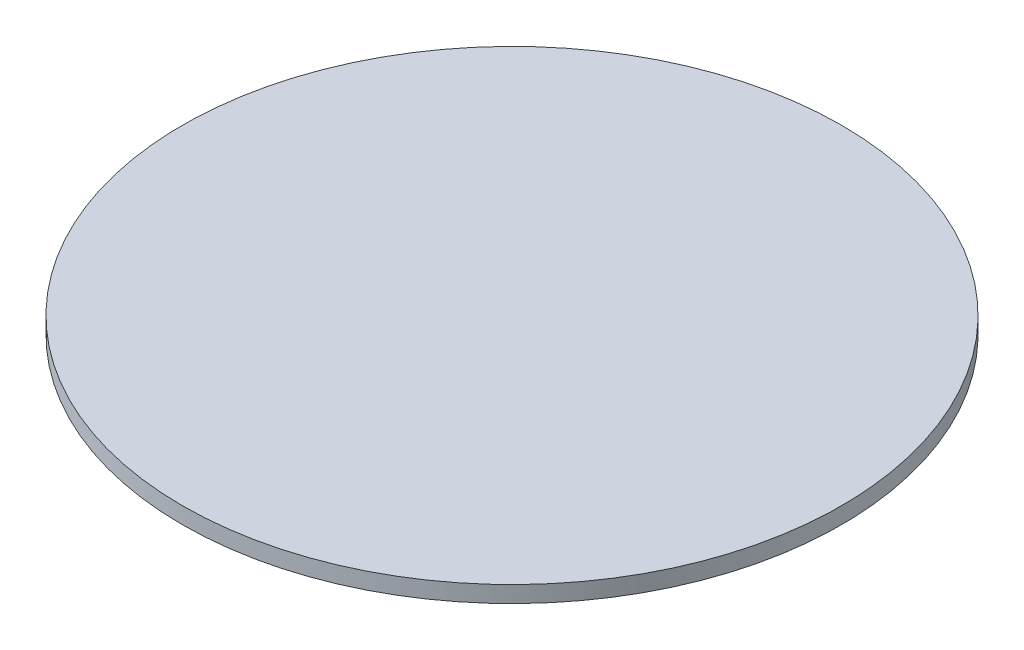
ISO-10303-21;
HEADER;
FILE_DESCRIPTION(('STEP AP214'),'2;1');
FILE_NAME('part.step','',(''),(''),'','','');
FILE_SCHEMA(('AUTOMOTIVE_DESIGN { 1 0 10303 214 1 1 1 1 }'));
ENDSEC;
DATA;
#1=APPLICATION_CONTEXT('core data for automotive mechanical design processes');
#2=APPLICATION_PROTOCOL_DEFINITION('international standard','automotive_design',2000,#1);
#3=PRODUCT_CONTEXT('',#1,'mechanical');
#4=PRODUCT('Part','Part','',(#3));
#5=PRODUCT_RELATED_PRODUCT_CATEGORY('part','',(#4));
#6=PRODUCT_DEFINITION_FORMATION('','',#4);
#7=PRODUCT_DEFINITION_CONTEXT('part definition',#1,'design');
#8=PRODUCT_DEFINITION('design','',#6,#7);
#9=PRODUCT_DEFINITION_SHAPE('','',#8);
#10=(LENGTH_UNIT() NAMED_UNIT(*) SI_UNIT(.MILLI.,.METRE.));
#11=(NAMED_UNIT(*) PLANE_ANGLE_UNIT() SI_UNIT($,.RADIAN.));
#12=(NAMED_UNIT(*) SI_UNIT($,.STERADIAN.) SOLID_ANGLE_UNIT());
#13=UNCERTAINTY_MEASURE_WITH_UNIT(LENGTH_MEASURE(1.E-05),#10,'distance_accuracy_value','');
#14=(GEOMETRIC_REPRESENTATION_CONTEXT(3) GLOBAL_UNCERTAINTY_ASSIGNED_CONTEXT((#13)) GLOBAL_UNIT_ASSIGNED_CONTEXT((#10,
#11,#12)) REPRESENTATION_CONTEXT('',''));
#15=CARTESIAN_POINT('',(0.,0.,0.));
#16=DIRECTION('',(0.,0.,1.));
#17=DIRECTION('',(1.,0.,0.));
#18=AXIS2_PLACEMENT_3D('',#15,#16,#17);
#19=CARTESIAN_POINT('',(0.,6.35,0.));
#20=DIRECTION('',(0.,-1.,0.));
#21=DIRECTION('',(0.,0.,-1.));
#22=AXIS2_PLACEMENT_3D('',#19,#20,#21);
#23=CYLINDRICAL_SURFACE('',#22,127.);
#24=CARTESIAN_POINT('',(0.,6.35,0.));
#25=DIRECTION('',(0.,1.,0.));
#26=DIRECTION('',(0.,0.,1.));
#27=AXIS2_PLACEMENT_3D('',#24,#25,#26);
#28=CIRCLE('',#27,127.);
#29=CARTESIAN_POINT('',(0.,6.35,127.));
#30=VERTEX_POINT('',#29);
#31=EDGE_CURVE('E10',#30,#30,#28,.T.);
#32=ORIENTED_EDGE('',*,*,#31,.F.);
#33=EDGE_LOOP('',(#32));
#34=FACE_BOUND('',#33,.T.);
#35=CARTESIAN_POINT('',(0.,0.,0.));
#36=DIRECTION('',(0.,1.,0.));
#37=DIRECTION('',(0.,0.,1.));
#38=AXIS2_PLACEMENT_3D('',#35,#36,#37);
#39=CIRCLE('',#38,127.);
#40=CARTESIAN_POINT('',(0.,0.,127.));
#41=VERTEX_POINT('',#40);
#42=EDGE_CURVE('E36',#41,#41,#39,.T.);
#43=ORIENTED_EDGE('',*,*,#42,.T.);
#44=EDGE_LOOP('',(#43));
#45=FACE_BOUND('',#44,.T.);
#46=ADVANCED_FACE('F33',(#34,#45),#23,.T.);
#47=CARTESIAN_POINT('',(0.,6.35,0.));
#48=DIRECTION('',(0.,1.,0.));
#49=DIRECTION('',(0.,0.,1.));
#50=AXIS2_PLACEMENT_3D('',#47,#48,#49);
#51=PLANE('',#50);
#52=ORIENTED_EDGE('',*,*,#31,.T.);
#53=EDGE_LOOP('',(#52));
#54=FACE_BOUND('',#53,.T.);
#55=ADVANCED_FACE('F48',(#54),#51,.T.);
#56=CARTESIAN_POINT('',(0.,0.,0.));
#57=DIRECTION('',(0.,1.,0.));
#58=DIRECTION('',(0.,0.,1.));
#59=AXIS2_PLACEMENT_3D('',#56,#57,#58);
#60=PLANE('',#59);
#61=ORIENTED_EDGE('',*,*,#42,.F.);
#62=EDGE_LOOP('',(#61));
#63=FACE_BOUND('',#62,.T.);
#64=ADVANCED_FACE('F46',(#63),#60,.F.);
#65=CLOSED_SHELL('',(#46,#55,#64));
#66=MANIFOLD_SOLID_BREP('B2',#65);
#67=ADVANCED_BREP_SHAPE_REPRESENTATION('',(#18,#66),#14);
#68=SHAPE_DEFINITION_REPRESENTATION(#9,#67);
ENDSEC;
END-ISO-10303-21;
